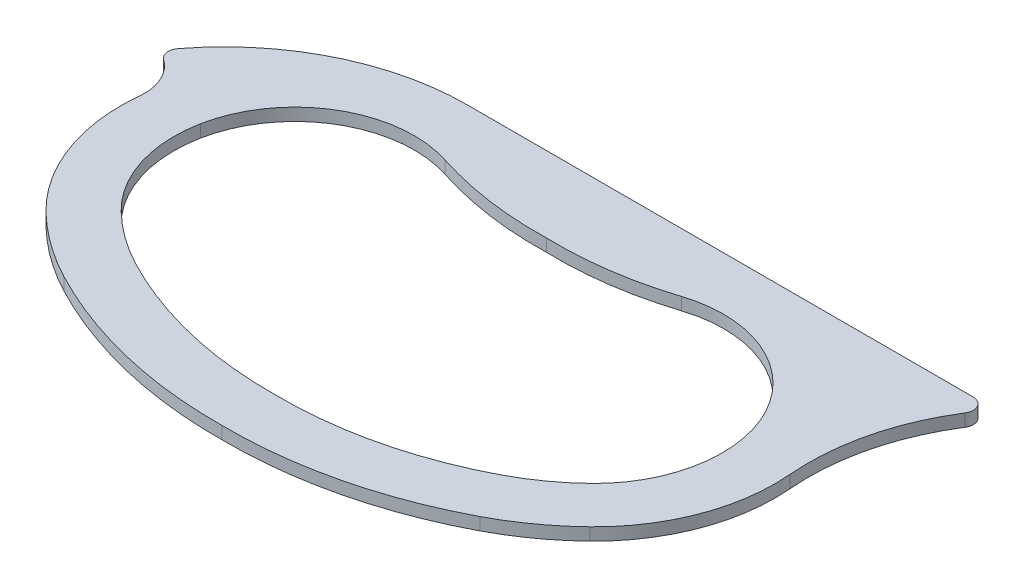
ISO-10303-21;
HEADER;
FILE_DESCRIPTION(('STEP AP214'),'2;1');
FILE_NAME('part.step','',(''),(''),'','','');
FILE_SCHEMA(('AUTOMOTIVE_DESIGN { 1 0 10303 214 1 1 1 1 }'));
ENDSEC;
DATA;
#1=APPLICATION_CONTEXT('core data for automotive mechanical design processes');
#2=APPLICATION_PROTOCOL_DEFINITION('international standard','automotive_design',2000,#1);
#3=PRODUCT_CONTEXT('',#1,'mechanical');
#4=PRODUCT('Part','Part','',(#3));
#5=PRODUCT_RELATED_PRODUCT_CATEGORY('part','',(#4));
#6=PRODUCT_DEFINITION_FORMATION('','',#4);
#7=PRODUCT_DEFINITION_CONTEXT('part definition',#1,'design');
#8=PRODUCT_DEFINITION('design','',#6,#7);
#9=PRODUCT_DEFINITION_SHAPE('','',#8);
#10=(LENGTH_UNIT() NAMED_UNIT(*) SI_UNIT(.MILLI.,.METRE.));
#11=(NAMED_UNIT(*) PLANE_ANGLE_UNIT() SI_UNIT($,.RADIAN.));
#12=(NAMED_UNIT(*) SI_UNIT($,.STERADIAN.) SOLID_ANGLE_UNIT());
#13=UNCERTAINTY_MEASURE_WITH_UNIT(LENGTH_MEASURE(1.E-05),#10,'distance_accuracy_value','');
#14=(GEOMETRIC_REPRESENTATION_CONTEXT(3) GLOBAL_UNCERTAINTY_ASSIGNED_CONTEXT((#13)) GLOBAL_UNIT_ASSIGNED_CONTEXT((#10,
#11,#12)) REPRESENTATION_CONTEXT('',''));
#15=CARTESIAN_POINT('',(0.,0.,0.));
#16=DIRECTION('',(0.,0.,1.));
#17=DIRECTION('',(1.,0.,0.));
#18=AXIS2_PLACEMENT_3D('',#15,#16,#17);
#19=CARTESIAN_POINT('',(-31.7447289656254,3.,41.3908696564592));
#20=DIRECTION('',(0.,1.,0.));
#21=DIRECTION('',(0.,0.,1.));
#22=AXIS2_PLACEMENT_3D('',#19,#20,#21);
#23=PLANE('',#22);
#24=CARTESIAN_POINT('',(-31.7447289656254,3.,41.3908696564592));
#25=DIRECTION('',(0.,1.,0.));
#26=DIRECTION('',(0.,0.,1.));
#27=AXIS2_PLACEMENT_3D('',#24,#25,#26);
#28=CIRCLE('',#27,58.5377173375249);
#29=CARTESIAN_POINT('',(-31.7447289656254,3.,-17.1468476691929));
#30=VERTEX_POINT('',#29);
#31=CARTESIAN_POINT('',(-78.384627261813,3.,6.01595991241534));
#32=VERTEX_POINT('',#31);
#33=EDGE_CURVE('E266',#30,#32,#28,.T.);
#34=ORIENTED_EDGE('',*,*,#33,.T.);
#35=CARTESIAN_POINT('',(-76.1537286012135,3.,7.70802704055631));
#36=DIRECTION('',(0.,1.,0.));
#37=DIRECTION('',(0.,0.,1.));
#38=AXIS2_PLACEMENT_3D('',#35,#36,#37);
#39=CIRCLE('',#38,2.8);
#40=CARTESIAN_POINT('',(-77.7967382942179,3.,9.97529834075258));
#41=VERTEX_POINT('',#40);
#42=EDGE_CURVE('E269',#32,#41,#39,.T.);
#43=ORIENTED_EDGE('',*,*,#42,.T.);
#44=CARTESIAN_POINT('',(-84.5355399107844,3.,19.2745079364176));
#45=DIRECTION('',(0.,-1.,0.));
#46=DIRECTION('',(0.,0.,-1.));
#47=AXIS2_PLACEMENT_3D('',#44,#45,#46);
#48=CIRCLE('',#47,11.4841955021476);
#49=CARTESIAN_POINT('',(-73.1089146980619,3.,20.4229776049423));
#50=VERTEX_POINT('',#49);
#51=EDGE_CURVE('E272',#41,#50,#48,.T.);
#52=ORIENTED_EDGE('',*,*,#51,.T.);
#53=CARTESIAN_POINT('',(-29.8103535259317,3.,24.7748385674937));
#54=DIRECTION('',(0.,1.,0.));
#55=DIRECTION('',(0.,0.,-1.));
#56=AXIS2_PLACEMENT_3D('',#53,#54,#55);
#57=CIRCLE('',#56,43.5167105077358);
#58=CARTESIAN_POINT('',(-60.0306601298384,3.,56.0867717907866));
#59=VERTEX_POINT('',#58);
#60=EDGE_CURVE('E274',#50,#59,#57,.T.);
#61=ORIENTED_EDGE('',*,*,#60,.T.);
#62=CARTESIAN_POINT('',(-13.3661326347816,3.,7.73661479294711));
#63=DIRECTION('',(0.,1.,0.));
#64=DIRECTION('',(0.,0.,1.));
#65=AXIS2_PLACEMENT_3D('',#62,#63,#64);
#66=CIRCLE('',#65,67.1960996491064);
#67=CARTESIAN_POINT('',(-44.5902153699683,3.,67.2376439050465));
#68=VERTEX_POINT('',#67);
#69=EDGE_CURVE('E276',#59,#68,#66,.T.);
#70=ORIENTED_EDGE('',*,*,#69,.T.);
#71=CARTESIAN_POINT('',(4.30741818289308,3.,-25.9423397062211));
#72=DIRECTION('',(0.,1.,0.));
#73=DIRECTION('',(0.,0.,1.));
#74=AXIS2_PLACEMENT_3D('',#71,#72,#73);
#75=CIRCLE('',#74,105.230641511235);
#76=CARTESIAN_POINT('',(5.51444306841968,3.,79.2813791208183));
#77=VERTEX_POINT('',#76);
#78=EDGE_CURVE('E278',#68,#77,#75,.T.);
#79=ORIENTED_EDGE('',*,*,#78,.T.);
#80=CARTESIAN_POINT('',(6.7214679538708,3.,-25.9423397062211));
#81=DIRECTION('',(0.,1.,0.));
#82=DIRECTION('',(0.,0.,-1.));
#83=AXIS2_PLACEMENT_3D('',#80,#81,#82);
#84=CIRCLE('',#83,105.230641511234);
#85=CARTESIAN_POINT('',(55.619101506732,3.,67.2376439050462));
#86=VERTEX_POINT('',#85);
#87=EDGE_CURVE('E280',#77,#86,#84,.T.);
#88=ORIENTED_EDGE('',*,*,#87,.T.);
#89=CARTESIAN_POINT('',(24.3950187715454,3.,7.73661479294711));
#90=DIRECTION('',(0.,1.,0.));
#91=DIRECTION('',(0.,0.,-1.));
#92=AXIS2_PLACEMENT_3D('',#89,#90,#91);
#93=CIRCLE('',#92,67.1960996491064);
#94=CARTESIAN_POINT('',(71.0595462666022,3.,56.0867717907866));
#95=VERTEX_POINT('',#94);
#96=EDGE_CURVE('E282',#86,#95,#93,.T.);
#97=ORIENTED_EDGE('',*,*,#96,.T.);
#98=CARTESIAN_POINT('',(40.8392396626955,3.,24.7748385674937));
#99=DIRECTION('',(0.,1.,0.));
#100=DIRECTION('',(0.,0.,-1.));
#101=AXIS2_PLACEMENT_3D('',#98,#99,#100);
#102=CIRCLE('',#101,43.5167105077358);
#103=CARTESIAN_POINT('',(84.1970453406871,3.,21.0593601052228));
#104=VERTEX_POINT('',#103);
#105=EDGE_CURVE('E284',#95,#104,#102,.T.);
#106=ORIENTED_EDGE('',*,*,#105,.T.);
#107=CARTESIAN_POINT('',(138.651349121471,3.,16.3929848191192));
#108=DIRECTION('',(0.,-1.,0.));
#109=DIRECTION('',(0.,0.,1.));
#110=AXIS2_PLACEMENT_3D('',#107,#108,#109);
#111=CIRCLE('',#110,54.6538768849991);
#112=CARTESIAN_POINT('',(92.4781186143652,3.,-12.8487497925334));
#113=VERTEX_POINT('',#112);
#114=EDGE_CURVE('E286',#104,#113,#111,.T.);
#115=ORIENTED_EDGE('',*,*,#114,.T.);
#116=CARTESIAN_POINT('',(90.1125948347451,3.,-14.3468476691929));
#117=DIRECTION('',(0.,1.,0.));
#118=DIRECTION('',(0.,0.,1.));
#119=AXIS2_PLACEMENT_3D('',#116,#117,#118);
#120=CIRCLE('',#119,2.8);
#121=CARTESIAN_POINT('',(90.1125948347451,3.,-17.1468476691929));
#122=VERTEX_POINT('',#121);
#123=EDGE_CURVE('E288',#113,#122,#120,.T.);
#124=ORIENTED_EDGE('',*,*,#123,.T.);
#125=DIRECTION('',(-1.,0.,0.));
#126=VECTOR('',#125,1.);
#127=CARTESIAN_POINT('',(-31.7447289656254,3.,-17.1468476691929));
#128=LINE('',#127,#126);
#129=EDGE_CURVE('E290',#122,#30,#128,.T.);
#130=ORIENTED_EDGE('',*,*,#129,.T.);
#131=EDGE_LOOP('',(#34,#43,#52,#61,#70,#79,#88,#97,#106,#115,#124,#130));
#132=FACE_BOUND('',#131,.T.);
#133=CARTESIAN_POINT('',(-31.7447289656254,3.,24.3993878805688));
#134=DIRECTION('',(0.,1.,0.));
#135=DIRECTION('',(0.,0.,1.));
#136=AXIS2_PLACEMENT_3D('',#133,#134,#135);
#137=CIRCLE('',#136,28.7462355497617);
#138=CARTESIAN_POINT('',(-22.9726922600979,3.,-2.97573641721773));
#139=VERTEX_POINT('',#138);
#140=CARTESIAN_POINT('',(-59.9643273959869,3.,18.9221328461994));
#141=VERTEX_POINT('',#140);
#142=EDGE_CURVE('E195',#139,#141,#137,.T.);
#143=ORIENTED_EDGE('',*,*,#142,.F.);
#144=CARTESIAN_POINT('',(3.18944048075675,3.,-84.6205880883009));
#145=DIRECTION('',(0.,-1.,0.));
#146=DIRECTION('',(0.,0.,-1.));
#147=AXIS2_PLACEMENT_3D('',#144,#145,#146);
#148=CIRCLE('',#147,85.7341180274415);
#149=CARTESIAN_POINT('',(5.5144430683819,3.,1.08199855242315));
#150=VERTEX_POINT('',#149);
#151=EDGE_CURVE('E187',#150,#139,#148,.T.);
#152=ORIENTED_EDGE('',*,*,#151,.F.);
#153=CARTESIAN_POINT('',(7.83944565600712,3.,-84.6205880883009));
#154=DIRECTION('',(0.,-1.,0.));
#155=DIRECTION('',(0.,0.,1.));
#156=AXIS2_PLACEMENT_3D('',#153,#154,#155);
#157=CIRCLE('',#156,85.7341180274415);
#158=CARTESIAN_POINT('',(34.0015783968618,3.,-2.97573641721771));
#159=VERTEX_POINT('',#158);
#160=EDGE_CURVE('E224',#159,#150,#157,.T.);
#161=ORIENTED_EDGE('',*,*,#160,.F.);
#162=CARTESIAN_POINT('',(42.7736151023893,3.,24.3993878805688));
#163=DIRECTION('',(0.,1.,0.));
#164=DIRECTION('',(0.,0.,-1.));
#165=AXIS2_PLACEMENT_3D('',#162,#163,#164);
#166=CIRCLE('',#165,28.7462355497617);
#167=CARTESIAN_POINT('',(70.9932135327507,3.,18.9221328461994));
#168=VERTEX_POINT('',#167);
#169=EDGE_CURVE('E222',#168,#159,#166,.T.);
#170=ORIENTED_EDGE('',*,*,#169,.F.);
#171=CARTESIAN_POINT('',(40.8392396626955,3.,24.7748385674937));
#172=DIRECTION('',(0.,1.,0.));
#173=DIRECTION('',(0.,0.,-1.));
#174=AXIS2_PLACEMENT_3D('',#171,#172,#173);
#175=CIRCLE('',#174,30.7167105077358);
#176=CARTESIAN_POINT('',(62.1705489132466,3.,46.876683514769));
#177=VERTEX_POINT('',#176);
#178=EDGE_CURVE('E220',#177,#168,#175,.T.);
#179=ORIENTED_EDGE('',*,*,#178,.F.);
#180=CARTESIAN_POINT('',(24.3950187715454,3.,7.73661479294709));
#181=DIRECTION('',(0.,1.,0.));
#182=DIRECTION('',(0.,0.,-1.));
#183=AXIS2_PLACEMENT_3D('',#180,#181,#182);
#184=CIRCLE('',#183,54.3960996491064);
#185=CARTESIAN_POINT('',(49.6713119609484,3.,55.9034567035276));
#186=VERTEX_POINT('',#185);
#187=EDGE_CURVE('E218',#186,#177,#184,.T.);
#188=ORIENTED_EDGE('',*,*,#187,.F.);
#189=CARTESIAN_POINT('',(6.72146795387057,3.,-25.942339706222));
#190=DIRECTION('',(0.,1.,0.));
#191=DIRECTION('',(0.,0.,-1.));
#192=AXIS2_PLACEMENT_3D('',#189,#190,#191);
#193=CIRCLE('',#192,92.4306415112353);
#194=CARTESIAN_POINT('',(5.51444306841505,3.,66.4804203753964));
#195=VERTEX_POINT('',#194);
#196=EDGE_CURVE('E216',#195,#186,#193,.T.);
#197=ORIENTED_EDGE('',*,*,#196,.F.);
#198=CARTESIAN_POINT('',(4.30741818289331,3.,-25.942339706222));
#199=DIRECTION('',(0.,1.,0.));
#200=DIRECTION('',(0.,0.,1.));
#201=AXIS2_PLACEMENT_3D('',#198,#199,#200);
#202=CIRCLE('',#201,92.4306415112352);
#203=CARTESIAN_POINT('',(-38.6424258241845,3.,55.9034567035275));
#204=VERTEX_POINT('',#203);
#205=EDGE_CURVE('E214',#204,#195,#202,.T.);
#206=ORIENTED_EDGE('',*,*,#205,.F.);
#207=CARTESIAN_POINT('',(-13.3661326347816,3.,7.73661479294709));
#208=DIRECTION('',(0.,1.,0.));
#209=DIRECTION('',(0.,0.,1.));
#210=AXIS2_PLACEMENT_3D('',#207,#208,#209);
#211=CIRCLE('',#210,54.3960996491059);
#212=CARTESIAN_POINT('',(-51.1416627764824,3.,46.8766835147686));
#213=VERTEX_POINT('',#212);
#214=EDGE_CURVE('E210',#213,#204,#211,.T.);
#215=ORIENTED_EDGE('',*,*,#214,.F.);
#216=CARTESIAN_POINT('',(-29.8103535259317,3.,24.7748385674937));
#217=DIRECTION('',(0.,1.,0.));
#218=DIRECTION('',(0.,0.,1.));
#219=AXIS2_PLACEMENT_3D('',#216,#217,#218);
#220=CIRCLE('',#219,30.7167105077358);
#221=EDGE_CURVE('E208',#141,#213,#220,.T.);
#222=ORIENTED_EDGE('',*,*,#221,.F.);
#223=EDGE_LOOP('',(#143,#152,#161,#170,#179,#188,#197,#206,#215,#222));
#224=FACE_BOUND('',#223,.T.);
#225=ADVANCED_FACE('F38',(#132,#224),#23,.T.);
#226=CARTESIAN_POINT('',(-31.7447289656254,0.,41.3908696564592));
#227=DIRECTION('',(0.,1.,0.));
#228=DIRECTION('',(0.,0.,1.));
#229=AXIS2_PLACEMENT_3D('',#226,#227,#228);
#230=PLANE('',#229);
#231=CARTESIAN_POINT('',(-31.7447289656254,0.,41.3908696564592));
#232=DIRECTION('',(0.,1.,0.));
#233=DIRECTION('',(0.,0.,1.));
#234=AXIS2_PLACEMENT_3D('',#231,#232,#233);
#235=CIRCLE('',#234,58.5377173375249);
#236=CARTESIAN_POINT('',(-31.7447289656254,0.,-17.1468476691929));
#237=VERTEX_POINT('',#236);
#238=CARTESIAN_POINT('',(-78.384627261813,0.,6.01595991241534));
#239=VERTEX_POINT('',#238);
#240=EDGE_CURVE('E203',#237,#239,#235,.T.);
#241=ORIENTED_EDGE('',*,*,#240,.F.);
#242=DIRECTION('',(-1.,0.,0.));
#243=VECTOR('',#242,1.);
#244=CARTESIAN_POINT('',(-31.7447289656254,0.,-17.1468476691929));
#245=LINE('',#244,#243);
#246=CARTESIAN_POINT('',(90.1125948347451,0.,-17.1468476691929));
#247=VERTEX_POINT('',#246);
#248=EDGE_CURVE('E270',#247,#237,#245,.T.);
#249=ORIENTED_EDGE('',*,*,#248,.F.);
#250=CARTESIAN_POINT('',(90.1125948347451,0.,-14.3468476691929));
#251=DIRECTION('',(0.,1.,0.));
#252=DIRECTION('',(0.,0.,1.));
#253=AXIS2_PLACEMENT_3D('',#250,#251,#252);
#254=CIRCLE('',#253,2.8);
#255=CARTESIAN_POINT('',(92.4781186143652,0.,-12.8487497925334));
#256=VERTEX_POINT('',#255);
#257=EDGE_CURVE('E313',#256,#247,#254,.T.);
#258=ORIENTED_EDGE('',*,*,#257,.F.);
#259=CARTESIAN_POINT('',(138.651349121471,0.,16.3929848191192));
#260=DIRECTION('',(0.,-1.,0.));
#261=DIRECTION('',(0.,0.,1.));
#262=AXIS2_PLACEMENT_3D('',#259,#260,#261);
#263=CIRCLE('',#262,54.6538768849991);
#264=CARTESIAN_POINT('',(84.1970453406871,0.,21.0593601052228));
#265=VERTEX_POINT('',#264);
#266=EDGE_CURVE('E311',#265,#256,#263,.T.);
#267=ORIENTED_EDGE('',*,*,#266,.F.);
#268=CARTESIAN_POINT('',(40.8392396626955,0.,24.7748385674937));
#269=DIRECTION('',(0.,1.,0.));
#270=DIRECTION('',(0.,0.,-1.));
#271=AXIS2_PLACEMENT_3D('',#268,#269,#270);
#272=CIRCLE('',#271,43.5167105077358);
#273=CARTESIAN_POINT('',(71.0595462666022,0.,56.0867717907866));
#274=VERTEX_POINT('',#273);
#275=EDGE_CURVE('E309',#274,#265,#272,.T.);
#276=ORIENTED_EDGE('',*,*,#275,.F.);
#277=CARTESIAN_POINT('',(24.3950187715454,0.,7.73661479294711));
#278=DIRECTION('',(0.,1.,0.));
#279=DIRECTION('',(0.,0.,-1.));
#280=AXIS2_PLACEMENT_3D('',#277,#278,#279);
#281=CIRCLE('',#280,67.1960996491064);
#282=CARTESIAN_POINT('',(55.619101506732,0.,67.2376439050462));
#283=VERTEX_POINT('',#282);
#284=EDGE_CURVE('E307',#283,#274,#281,.T.);
#285=ORIENTED_EDGE('',*,*,#284,.F.);
#286=CARTESIAN_POINT('',(6.7214679538708,0.,-25.9423397062211));
#287=DIRECTION('',(0.,1.,0.));
#288=DIRECTION('',(0.,0.,-1.));
#289=AXIS2_PLACEMENT_3D('',#286,#287,#288);
#290=CIRCLE('',#289,105.230641511234);
#291=CARTESIAN_POINT('',(5.51444306841968,0.,79.2813791208183));
#292=VERTEX_POINT('',#291);
#293=EDGE_CURVE('E305',#292,#283,#290,.T.);
#294=ORIENTED_EDGE('',*,*,#293,.F.);
#295=CARTESIAN_POINT('',(4.30741818289308,0.,-25.9423397062211));
#296=DIRECTION('',(0.,1.,0.));
#297=DIRECTION('',(0.,0.,1.));
#298=AXIS2_PLACEMENT_3D('',#295,#296,#297);
#299=CIRCLE('',#298,105.230641511235);
#300=CARTESIAN_POINT('',(-44.5902153699683,0.,67.2376439050465));
#301=VERTEX_POINT('',#300);
#302=EDGE_CURVE('E303',#301,#292,#299,.T.);
#303=ORIENTED_EDGE('',*,*,#302,.F.);
#304=CARTESIAN_POINT('',(-13.3661326347816,0.,7.73661479294711));
#305=DIRECTION('',(0.,1.,0.));
#306=DIRECTION('',(0.,0.,1.));
#307=AXIS2_PLACEMENT_3D('',#304,#305,#306);
#308=CIRCLE('',#307,67.1960996491064);
#309=CARTESIAN_POINT('',(-60.0306601298384,0.,56.0867717907866));
#310=VERTEX_POINT('',#309);
#311=EDGE_CURVE('E301',#310,#301,#308,.T.);
#312=ORIENTED_EDGE('',*,*,#311,.F.);
#313=CARTESIAN_POINT('',(-29.8103535259317,0.,24.7748385674937));
#314=DIRECTION('',(0.,1.,0.));
#315=DIRECTION('',(0.,0.,-1.));
#316=AXIS2_PLACEMENT_3D('',#313,#314,#315);
#317=CIRCLE('',#316,43.5167105077358);
#318=CARTESIAN_POINT('',(-73.1089146980619,0.,20.4229776049423));
#319=VERTEX_POINT('',#318);
#320=EDGE_CURVE('E299',#319,#310,#317,.T.);
#321=ORIENTED_EDGE('',*,*,#320,.F.);
#322=CARTESIAN_POINT('',(-84.5355399107844,0.,19.2745079364176));
#323=DIRECTION('',(0.,-1.,0.));
#324=DIRECTION('',(0.,0.,-1.));
#325=AXIS2_PLACEMENT_3D('',#322,#323,#324);
#326=CIRCLE('',#325,11.4841955021476);
#327=CARTESIAN_POINT('',(-77.7967382942179,0.,9.97529834075258));
#328=VERTEX_POINT('',#327);
#329=EDGE_CURVE('E297',#328,#319,#326,.T.);
#330=ORIENTED_EDGE('',*,*,#329,.F.);
#331=CARTESIAN_POINT('',(-76.1537286012135,0.,7.70802704055631));
#332=DIRECTION('',(0.,1.,0.));
#333=DIRECTION('',(0.,0.,1.));
#334=AXIS2_PLACEMENT_3D('',#331,#332,#333);
#335=CIRCLE('',#334,2.8);
#336=EDGE_CURVE('E295',#239,#328,#335,.T.);
#337=ORIENTED_EDGE('',*,*,#336,.F.);
#338=EDGE_LOOP('',(#241,#249,#258,#267,#276,#285,#294,#303,#312,#321,#330,#337));
#339=FACE_BOUND('',#338,.T.);
#340=CARTESIAN_POINT('',(3.18944048075675,0.,-84.6205880883009));
#341=DIRECTION('',(0.,-1.,0.));
#342=DIRECTION('',(0.,0.,-1.));
#343=AXIS2_PLACEMENT_3D('',#340,#341,#342);
#344=CIRCLE('',#343,85.7341180274415);
#345=CARTESIAN_POINT('',(5.5144430683819,0.,1.08199855242315));
#346=VERTEX_POINT('',#345);
#347=CARTESIAN_POINT('',(-22.9726922600979,0.,-2.97573641721773));
#348=VERTEX_POINT('',#347);
#349=EDGE_CURVE('E61',#346,#348,#344,.T.);
#350=ORIENTED_EDGE('',*,*,#349,.T.);
#351=CARTESIAN_POINT('',(-31.7447289656254,0.,24.3993878805688));
#352=DIRECTION('',(0.,1.,0.));
#353=DIRECTION('',(0.,0.,1.));
#354=AXIS2_PLACEMENT_3D('',#351,#352,#353);
#355=CIRCLE('',#354,28.7462355497617);
#356=CARTESIAN_POINT('',(-59.9643273959869,0.,18.9221328461994));
#357=VERTEX_POINT('',#356);
#358=EDGE_CURVE('E202',#348,#357,#355,.T.);
#359=ORIENTED_EDGE('',*,*,#358,.T.);
#360=CARTESIAN_POINT('',(-29.8103535259317,0.,24.7748385674937));
#361=DIRECTION('',(0.,1.,0.));
#362=DIRECTION('',(0.,0.,1.));
#363=AXIS2_PLACEMENT_3D('',#360,#361,#362);
#364=CIRCLE('',#363,30.7167105077358);
#365=CARTESIAN_POINT('',(-51.1416627764824,0.,46.8766835147686));
#366=VERTEX_POINT('',#365);
#367=EDGE_CURVE('E228',#357,#366,#364,.T.);
#368=ORIENTED_EDGE('',*,*,#367,.T.);
#369=CARTESIAN_POINT('',(-13.3661326347816,0.,7.73661479294709));
#370=DIRECTION('',(0.,1.,0.));
#371=DIRECTION('',(0.,0.,1.));
#372=AXIS2_PLACEMENT_3D('',#369,#370,#371);
#373=CIRCLE('',#372,54.3960996491059);
#374=CARTESIAN_POINT('',(-38.6424258241845,0.,55.9034567035275));
#375=VERTEX_POINT('',#374);
#376=EDGE_CURVE('E231',#366,#375,#373,.T.);
#377=ORIENTED_EDGE('',*,*,#376,.T.);
#378=CARTESIAN_POINT('',(4.30741818289331,0.,-25.942339706222));
#379=DIRECTION('',(0.,1.,0.));
#380=DIRECTION('',(0.,0.,1.));
#381=AXIS2_PLACEMENT_3D('',#378,#379,#380);
#382=CIRCLE('',#381,92.4306415112352);
#383=CARTESIAN_POINT('',(5.51444306841505,0.,66.4804203753964));
#384=VERTEX_POINT('',#383);
#385=EDGE_CURVE('E234',#375,#384,#382,.T.);
#386=ORIENTED_EDGE('',*,*,#385,.T.);
#387=CARTESIAN_POINT('',(6.72146795387057,0.,-25.942339706222));
#388=DIRECTION('',(0.,1.,0.));
#389=DIRECTION('',(0.,0.,-1.));
#390=AXIS2_PLACEMENT_3D('',#387,#388,#389);
#391=CIRCLE('',#390,92.4306415112353);
#392=CARTESIAN_POINT('',(49.6713119609484,0.,55.9034567035276));
#393=VERTEX_POINT('',#392);
#394=EDGE_CURVE('E237',#384,#393,#391,.T.);
#395=ORIENTED_EDGE('',*,*,#394,.T.);
#396=CARTESIAN_POINT('',(24.3950187715454,0.,7.73661479294709));
#397=DIRECTION('',(0.,1.,0.));
#398=DIRECTION('',(0.,0.,-1.));
#399=AXIS2_PLACEMENT_3D('',#396,#397,#398);
#400=CIRCLE('',#399,54.3960996491064);
#401=CARTESIAN_POINT('',(62.1705489132466,0.,46.876683514769));
#402=VERTEX_POINT('',#401);
#403=EDGE_CURVE('E240',#393,#402,#400,.T.);
#404=ORIENTED_EDGE('',*,*,#403,.T.);
#405=CARTESIAN_POINT('',(40.8392396626955,0.,24.7748385674937));
#406=DIRECTION('',(0.,1.,0.));
#407=DIRECTION('',(0.,0.,-1.));
#408=AXIS2_PLACEMENT_3D('',#405,#406,#407);
#409=CIRCLE('',#408,30.7167105077358);
#410=CARTESIAN_POINT('',(70.9932135327507,0.,18.9221328461994));
#411=VERTEX_POINT('',#410);
#412=EDGE_CURVE('E243',#402,#411,#409,.T.);
#413=ORIENTED_EDGE('',*,*,#412,.T.);
#414=CARTESIAN_POINT('',(42.7736151023893,0.,24.3993878805688));
#415=DIRECTION('',(0.,1.,0.));
#416=DIRECTION('',(0.,0.,-1.));
#417=AXIS2_PLACEMENT_3D('',#414,#415,#416);
#418=CIRCLE('',#417,28.7462355497617);
#419=CARTESIAN_POINT('',(34.0015783968618,0.,-2.97573641721771));
#420=VERTEX_POINT('',#419);
#421=EDGE_CURVE('E246',#411,#420,#418,.T.);
#422=ORIENTED_EDGE('',*,*,#421,.T.);
#423=CARTESIAN_POINT('',(7.83944565600712,0.,-84.6205880883009));
#424=DIRECTION('',(0.,-1.,0.));
#425=DIRECTION('',(0.,0.,1.));
#426=AXIS2_PLACEMENT_3D('',#423,#424,#425);
#427=CIRCLE('',#426,85.7341180274415);
#428=EDGE_CURVE('E196',#420,#346,#427,.T.);
#429=ORIENTED_EDGE('',*,*,#428,.T.);
#430=EDGE_LOOP('',(#350,#359,#368,#377,#386,#395,#404,#413,#422,#429));
#431=FACE_BOUND('',#430,.T.);
#432=ADVANCED_FACE('F355',(#339,#431),#230,.F.);
#433=CARTESIAN_POINT('',(-31.7447289656254,3.,41.3908696564592));
#434=DIRECTION('',(0.,-1.,0.));
#435=DIRECTION('',(0.,0.,-1.));
#436=AXIS2_PLACEMENT_3D('',#433,#434,#435);
#437=CYLINDRICAL_SURFACE('',#436,58.5377173375249);
#438=ORIENTED_EDGE('',*,*,#240,.T.);
#439=DIRECTION('',(0.,-1.,0.));
#440=VECTOR('',#439,1.);
#441=CARTESIAN_POINT('',(-78.384627261813,3.,6.01595991241534));
#442=LINE('',#441,#440);
#443=EDGE_CURVE('E11',#32,#239,#442,.T.);
#444=ORIENTED_EDGE('',*,*,#443,.F.);
#445=ORIENTED_EDGE('',*,*,#33,.F.);
#446=DIRECTION('',(0.,-1.,0.));
#447=VECTOR('',#446,1.);
#448=CARTESIAN_POINT('',(-31.7447289656254,3.,-17.1468476691929));
#449=LINE('',#448,#447);
#450=EDGE_CURVE('E292',#30,#237,#449,.T.);
#451=ORIENTED_EDGE('',*,*,#450,.T.);
#452=EDGE_LOOP('',(#438,#444,#445,#451));
#453=FACE_BOUND('',#452,.T.);
#454=ADVANCED_FACE('F40',(#453),#437,.T.);
#455=CARTESIAN_POINT('',(-76.1537286012135,3.,7.70802704055631));
#456=DIRECTION('',(0.,-1.,0.));
#457=DIRECTION('',(0.,0.,-1.));
#458=AXIS2_PLACEMENT_3D('',#455,#456,#457);
#459=CYLINDRICAL_SURFACE('',#458,2.8);
#460=ORIENTED_EDGE('',*,*,#336,.T.);
#461=DIRECTION('',(0.,-1.,0.));
#462=VECTOR('',#461,1.);
#463=CARTESIAN_POINT('',(-77.7967382942179,3.,9.97529834075258));
#464=LINE('',#463,#462);
#465=EDGE_CURVE('E46',#41,#328,#464,.T.);
#466=ORIENTED_EDGE('',*,*,#465,.F.);
#467=ORIENTED_EDGE('',*,*,#42,.F.);
#468=ORIENTED_EDGE('',*,*,#443,.T.);
#469=EDGE_LOOP('',(#460,#466,#467,#468));
#470=FACE_BOUND('',#469,.T.);
#471=ADVANCED_FACE('F372',(#470),#459,.T.);
#472=CARTESIAN_POINT('',(-84.5355399107844,3.,19.2745079364176));
#473=DIRECTION('',(0.,-1.,0.));
#474=DIRECTION('',(0.,0.,-1.));
#475=AXIS2_PLACEMENT_3D('',#472,#473,#474);
#476=CYLINDRICAL_SURFACE('',#475,11.4841955021476);
#477=ORIENTED_EDGE('',*,*,#329,.T.);
#478=DIRECTION('',(0.,-1.,0.));
#479=VECTOR('',#478,1.);
#480=CARTESIAN_POINT('',(-73.1089146980619,3.,20.4229776049423));
#481=LINE('',#480,#479);
#482=EDGE_CURVE('E342',#50,#319,#481,.T.);
#483=ORIENTED_EDGE('',*,*,#482,.F.);
#484=ORIENTED_EDGE('',*,*,#51,.F.);
#485=ORIENTED_EDGE('',*,*,#465,.T.);
#486=EDGE_LOOP('',(#477,#483,#484,#485));
#487=FACE_BOUND('',#486,.T.);
#488=ADVANCED_FACE('F349',(#487),#476,.F.);
#489=CARTESIAN_POINT('',(-29.8103535259317,3.,24.7748385674937));
#490=DIRECTION('',(0.,-1.,0.));
#491=DIRECTION('',(0.,0.,-1.));
#492=AXIS2_PLACEMENT_3D('',#489,#490,#491);
#493=CYLINDRICAL_SURFACE('',#492,43.5167105077358);
#494=ORIENTED_EDGE('',*,*,#320,.T.);
#495=DIRECTION('',(0.,-1.,0.));
#496=VECTOR('',#495,1.);
#497=CARTESIAN_POINT('',(-60.0306601298384,3.,56.0867717907866));
#498=LINE('',#497,#496);
#499=EDGE_CURVE('E339',#59,#310,#498,.T.);
#500=ORIENTED_EDGE('',*,*,#499,.F.);
#501=ORIENTED_EDGE('',*,*,#60,.F.);
#502=ORIENTED_EDGE('',*,*,#482,.T.);
#503=EDGE_LOOP('',(#494,#500,#501,#502));
#504=FACE_BOUND('',#503,.T.);
#505=ADVANCED_FACE('F361',(#504),#493,.T.);
#506=CARTESIAN_POINT('',(-13.3661326347816,3.,7.73661479294711));
#507=DIRECTION('',(0.,-1.,0.));
#508=DIRECTION('',(0.,0.,-1.));
#509=AXIS2_PLACEMENT_3D('',#506,#507,#508);
#510=CYLINDRICAL_SURFACE('',#509,67.1960996491064);
#511=ORIENTED_EDGE('',*,*,#311,.T.);
#512=DIRECTION('',(0.,-1.,0.));
#513=VECTOR('',#512,1.);
#514=CARTESIAN_POINT('',(-44.5902153699683,3.,67.2376439050465));
#515=LINE('',#514,#513);
#516=EDGE_CURVE('E336',#68,#301,#515,.T.);
#517=ORIENTED_EDGE('',*,*,#516,.F.);
#518=ORIENTED_EDGE('',*,*,#69,.F.);
#519=ORIENTED_EDGE('',*,*,#499,.T.);
#520=EDGE_LOOP('',(#511,#517,#518,#519));
#521=FACE_BOUND('',#520,.T.);
#522=ADVANCED_FACE('F365',(#521),#510,.T.);
#523=CARTESIAN_POINT('',(4.30741818289308,3.,-25.9423397062211));
#524=DIRECTION('',(0.,-1.,0.));
#525=DIRECTION('',(0.,0.,-1.));
#526=AXIS2_PLACEMENT_3D('',#523,#524,#525);
#527=CYLINDRICAL_SURFACE('',#526,105.230641511235);
#528=ORIENTED_EDGE('',*,*,#302,.T.);
#529=DIRECTION('',(0.,-1.,0.));
#530=VECTOR('',#529,1.);
#531=CARTESIAN_POINT('',(5.51444306841968,3.,79.2813791208183));
#532=LINE('',#531,#530);
#533=EDGE_CURVE('E333',#77,#292,#532,.T.);
#534=ORIENTED_EDGE('',*,*,#533,.F.);
#535=ORIENTED_EDGE('',*,*,#78,.F.);
#536=ORIENTED_EDGE('',*,*,#516,.T.);
#537=EDGE_LOOP('',(#528,#534,#535,#536));
#538=FACE_BOUND('',#537,.T.);
#539=ADVANCED_FACE('F405',(#538),#527,.T.);
#540=CARTESIAN_POINT('',(6.7214679538708,3.,-25.9423397062211));
#541=DIRECTION('',(0.,-1.,0.));
#542=DIRECTION('',(0.,0.,-1.));
#543=AXIS2_PLACEMENT_3D('',#540,#541,#542);
#544=CYLINDRICAL_SURFACE('',#543,105.230641511234);
#545=ORIENTED_EDGE('',*,*,#293,.T.);
#546=DIRECTION('',(0.,-1.,0.));
#547=VECTOR('',#546,1.);
#548=CARTESIAN_POINT('',(55.619101506732,3.,67.2376439050462));
#549=LINE('',#548,#547);
#550=EDGE_CURVE('E330',#86,#283,#549,.T.);
#551=ORIENTED_EDGE('',*,*,#550,.F.);
#552=ORIENTED_EDGE('',*,*,#87,.F.);
#553=ORIENTED_EDGE('',*,*,#533,.T.);
#554=EDGE_LOOP('',(#545,#551,#552,#553));
#555=FACE_BOUND('',#554,.T.);
#556=ADVANCED_FACE('F403',(#555),#544,.T.);
#557=CARTESIAN_POINT('',(24.3950187715454,3.,7.73661479294711));
#558=DIRECTION('',(0.,-1.,0.));
#559=DIRECTION('',(0.,0.,-1.));
#560=AXIS2_PLACEMENT_3D('',#557,#558,#559);
#561=CYLINDRICAL_SURFACE('',#560,67.1960996491064);
#562=ORIENTED_EDGE('',*,*,#284,.T.);
#563=DIRECTION('',(0.,-1.,0.));
#564=VECTOR('',#563,1.);
#565=CARTESIAN_POINT('',(71.0595462666022,3.,56.0867717907866));
#566=LINE('',#565,#564);
#567=EDGE_CURVE('E327',#95,#274,#566,.T.);
#568=ORIENTED_EDGE('',*,*,#567,.F.);
#569=ORIENTED_EDGE('',*,*,#96,.F.);
#570=ORIENTED_EDGE('',*,*,#550,.T.);
#571=EDGE_LOOP('',(#562,#568,#569,#570));
#572=FACE_BOUND('',#571,.T.);
#573=ADVANCED_FACE('F399',(#572),#561,.T.);
#574=CARTESIAN_POINT('',(40.8392396626955,3.,24.7748385674937));
#575=DIRECTION('',(0.,-1.,0.));
#576=DIRECTION('',(0.,0.,-1.));
#577=AXIS2_PLACEMENT_3D('',#574,#575,#576);
#578=CYLINDRICAL_SURFACE('',#577,43.5167105077358);
#579=ORIENTED_EDGE('',*,*,#275,.T.);
#580=DIRECTION('',(0.,-1.,0.));
#581=VECTOR('',#580,1.);
#582=CARTESIAN_POINT('',(84.1970453406871,3.,21.0593601052228));
#583=LINE('',#582,#581);
#584=EDGE_CURVE('E324',#104,#265,#583,.T.);
#585=ORIENTED_EDGE('',*,*,#584,.F.);
#586=ORIENTED_EDGE('',*,*,#105,.F.);
#587=ORIENTED_EDGE('',*,*,#567,.T.);
#588=EDGE_LOOP('',(#579,#585,#586,#587));
#589=FACE_BOUND('',#588,.T.);
#590=ADVANCED_FACE('F394',(#589),#578,.T.);
#591=CARTESIAN_POINT('',(138.651349121471,3.,16.3929848191192));
#592=DIRECTION('',(0.,-1.,0.));
#593=DIRECTION('',(0.,0.,-1.));
#594=AXIS2_PLACEMENT_3D('',#591,#592,#593);
#595=CYLINDRICAL_SURFACE('',#594,54.6538768849991);
#596=ORIENTED_EDGE('',*,*,#266,.T.);
#597=DIRECTION('',(0.,-1.,0.));
#598=VECTOR('',#597,1.);
#599=CARTESIAN_POINT('',(92.4781186143652,3.,-12.8487497925334));
#600=LINE('',#599,#598);
#601=EDGE_CURVE('E321',#113,#256,#600,.T.);
#602=ORIENTED_EDGE('',*,*,#601,.F.);
#603=ORIENTED_EDGE('',*,*,#114,.F.);
#604=ORIENTED_EDGE('',*,*,#584,.T.);
#605=EDGE_LOOP('',(#596,#602,#603,#604));
#606=FACE_BOUND('',#605,.T.);
#607=ADVANCED_FACE('F388',(#606),#595,.F.);
#608=CARTESIAN_POINT('',(90.1125948347451,3.,-14.3468476691929));
#609=DIRECTION('',(0.,-1.,0.));
#610=DIRECTION('',(0.,0.,-1.));
#611=AXIS2_PLACEMENT_3D('',#608,#609,#610);
#612=CYLINDRICAL_SURFACE('',#611,2.8);
#613=ORIENTED_EDGE('',*,*,#257,.T.);
#614=DIRECTION('',(0.,-1.,0.));
#615=VECTOR('',#614,1.);
#616=CARTESIAN_POINT('',(90.1125948347451,3.,-17.1468476691929));
#617=LINE('',#616,#615);
#618=EDGE_CURVE('E318',#122,#247,#617,.T.);
#619=ORIENTED_EDGE('',*,*,#618,.F.);
#620=ORIENTED_EDGE('',*,*,#123,.F.);
#621=ORIENTED_EDGE('',*,*,#601,.T.);
#622=EDGE_LOOP('',(#613,#619,#620,#621));
#623=FACE_BOUND('',#622,.T.);
#624=ADVANCED_FACE('F384',(#623),#612,.T.);
#625=CARTESIAN_POINT('',(-31.7447289656254,3.,-17.1468476691929));
#626=DIRECTION('',(0.,0.,1.));
#627=DIRECTION('',(1.,0.,0.));
#628=AXIS2_PLACEMENT_3D('',#625,#626,#627);
#629=PLANE('',#628);
#630=ORIENTED_EDGE('',*,*,#248,.T.);
#631=ORIENTED_EDGE('',*,*,#450,.F.);
#632=ORIENTED_EDGE('',*,*,#129,.F.);
#633=ORIENTED_EDGE('',*,*,#618,.T.);
#634=EDGE_LOOP('',(#630,#631,#632,#633));
#635=FACE_BOUND('',#634,.T.);
#636=ADVANCED_FACE('F379',(#635),#629,.F.);
#637=CARTESIAN_POINT('',(3.18944048075675,3.,-84.6205880883009));
#638=DIRECTION('',(0.,-1.,0.));
#639=DIRECTION('',(0.,0.,-1.));
#640=AXIS2_PLACEMENT_3D('',#637,#638,#639);
#641=CYLINDRICAL_SURFACE('',#640,85.7341180274415);
#642=ORIENTED_EDGE('',*,*,#349,.F.);
#643=DIRECTION('',(0.,-1.,0.));
#644=VECTOR('',#643,1.);
#645=CARTESIAN_POINT('',(5.5144430683819,3.,1.08199855242315));
#646=LINE('',#645,#644);
#647=EDGE_CURVE('E191',#150,#346,#646,.T.);
#648=ORIENTED_EDGE('',*,*,#647,.F.);
#649=ORIENTED_EDGE('',*,*,#151,.T.);
#650=DIRECTION('',(0.,-1.,0.));
#651=VECTOR('',#650,1.);
#652=CARTESIAN_POINT('',(-22.9726922600979,3.,-2.97573641721773));
#653=LINE('',#652,#651);
#654=EDGE_CURVE('E190',#139,#348,#653,.T.);
#655=ORIENTED_EDGE('',*,*,#654,.T.);
#656=EDGE_LOOP('',(#642,#648,#649,#655));
#657=FACE_BOUND('',#656,.T.);
#658=ADVANCED_FACE('F189',(#657),#641,.T.);
#659=CARTESIAN_POINT('',(-31.7447289656254,3.,24.3993878805688));
#660=DIRECTION('',(0.,-1.,0.));
#661=DIRECTION('',(0.,0.,-1.));
#662=AXIS2_PLACEMENT_3D('',#659,#660,#661);
#663=CYLINDRICAL_SURFACE('',#662,28.7462355497617);
#664=ORIENTED_EDGE('',*,*,#358,.F.);
#665=ORIENTED_EDGE('',*,*,#654,.F.);
#666=ORIENTED_EDGE('',*,*,#142,.T.);
#667=DIRECTION('',(0.,-1.,0.));
#668=VECTOR('',#667,1.);
#669=CARTESIAN_POINT('',(-59.9643273959869,3.,18.9221328461994));
#670=LINE('',#669,#668);
#671=EDGE_CURVE('E204',#141,#357,#670,.T.);
#672=ORIENTED_EDGE('',*,*,#671,.T.);
#673=EDGE_LOOP('',(#664,#665,#666,#672));
#674=FACE_BOUND('',#673,.T.);
#675=ADVANCED_FACE('F199',(#674),#663,.F.);
#676=CARTESIAN_POINT('',(-29.8103535259317,3.,24.7748385674937));
#677=DIRECTION('',(0.,-1.,0.));
#678=DIRECTION('',(0.,0.,-1.));
#679=AXIS2_PLACEMENT_3D('',#676,#677,#678);
#680=CYLINDRICAL_SURFACE('',#679,30.7167105077358);
#681=ORIENTED_EDGE('',*,*,#367,.F.);
#682=ORIENTED_EDGE('',*,*,#671,.F.);
#683=ORIENTED_EDGE('',*,*,#221,.T.);
#684=DIRECTION('',(0.,-1.,0.));
#685=VECTOR('',#684,1.);
#686=CARTESIAN_POINT('',(-51.1416627764824,3.,46.8766835147686));
#687=LINE('',#686,#685);
#688=EDGE_CURVE('E263',#213,#366,#687,.T.);
#689=ORIENTED_EDGE('',*,*,#688,.T.);
#690=EDGE_LOOP('',(#681,#682,#683,#689));
#691=FACE_BOUND('',#690,.T.);
#692=ADVANCED_FACE('F463',(#691),#680,.F.);
#693=CARTESIAN_POINT('',(-13.3661326347816,3.,7.73661479294709));
#694=DIRECTION('',(0.,-1.,0.));
#695=DIRECTION('',(0.,0.,-1.));
#696=AXIS2_PLACEMENT_3D('',#693,#694,#695);
#697=CYLINDRICAL_SURFACE('',#696,54.3960996491059);
#698=ORIENTED_EDGE('',*,*,#376,.F.);
#699=ORIENTED_EDGE('',*,*,#688,.F.);
#700=ORIENTED_EDGE('',*,*,#214,.T.);
#701=DIRECTION('',(0.,-1.,0.));
#702=VECTOR('',#701,1.);
#703=CARTESIAN_POINT('',(-38.6424258241845,3.,55.9034567035275));
#704=LINE('',#703,#702);
#705=EDGE_CURVE('E261',#204,#375,#704,.T.);
#706=ORIENTED_EDGE('',*,*,#705,.T.);
#707=EDGE_LOOP('',(#698,#699,#700,#706));
#708=FACE_BOUND('',#707,.T.);
#709=ADVANCED_FACE('F469',(#708),#697,.F.);
#710=CARTESIAN_POINT('',(4.30741818289331,3.,-25.942339706222));
#711=DIRECTION('',(0.,-1.,0.));
#712=DIRECTION('',(0.,0.,-1.));
#713=AXIS2_PLACEMENT_3D('',#710,#711,#712);
#714=CYLINDRICAL_SURFACE('',#713,92.4306415112352);
#715=ORIENTED_EDGE('',*,*,#385,.F.);
#716=ORIENTED_EDGE('',*,*,#705,.F.);
#717=ORIENTED_EDGE('',*,*,#205,.T.);
#718=DIRECTION('',(0.,-1.,0.));
#719=VECTOR('',#718,1.);
#720=CARTESIAN_POINT('',(5.51444306841505,3.,66.4804203753964));
#721=LINE('',#720,#719);
#722=EDGE_CURVE('E259',#195,#384,#721,.T.);
#723=ORIENTED_EDGE('',*,*,#722,.T.);
#724=EDGE_LOOP('',(#715,#716,#717,#723));
#725=FACE_BOUND('',#724,.T.);
#726=ADVANCED_FACE('F477',(#725),#714,.F.);
#727=CARTESIAN_POINT('',(6.72146795387057,3.,-25.942339706222));
#728=DIRECTION('',(0.,-1.,0.));
#729=DIRECTION('',(0.,0.,-1.));
#730=AXIS2_PLACEMENT_3D('',#727,#728,#729);
#731=CYLINDRICAL_SURFACE('',#730,92.4306415112353);
#732=ORIENTED_EDGE('',*,*,#394,.F.);
#733=ORIENTED_EDGE('',*,*,#722,.F.);
#734=ORIENTED_EDGE('',*,*,#196,.T.);
#735=DIRECTION('',(0.,-1.,0.));
#736=VECTOR('',#735,1.);
#737=CARTESIAN_POINT('',(49.6713119609484,3.,55.9034567035276));
#738=LINE('',#737,#736);
#739=EDGE_CURVE('E257',#186,#393,#738,.T.);
#740=ORIENTED_EDGE('',*,*,#739,.T.);
#741=EDGE_LOOP('',(#732,#733,#734,#740));
#742=FACE_BOUND('',#741,.T.);
#743=ADVANCED_FACE('F485',(#742),#731,.F.);
#744=CARTESIAN_POINT('',(24.3950187715454,3.,7.73661479294709));
#745=DIRECTION('',(0.,-1.,0.));
#746=DIRECTION('',(0.,0.,-1.));
#747=AXIS2_PLACEMENT_3D('',#744,#745,#746);
#748=CYLINDRICAL_SURFACE('',#747,54.3960996491064);
#749=ORIENTED_EDGE('',*,*,#403,.F.);
#750=ORIENTED_EDGE('',*,*,#739,.F.);
#751=ORIENTED_EDGE('',*,*,#187,.T.);
#752=DIRECTION('',(0.,-1.,0.));
#753=VECTOR('',#752,1.);
#754=CARTESIAN_POINT('',(62.1705489132466,3.,46.876683514769));
#755=LINE('',#754,#753);
#756=EDGE_CURVE('E255',#177,#402,#755,.T.);
#757=ORIENTED_EDGE('',*,*,#756,.T.);
#758=EDGE_LOOP('',(#749,#750,#751,#757));
#759=FACE_BOUND('',#758,.T.);
#760=ADVANCED_FACE('F493',(#759),#748,.F.);
#761=CARTESIAN_POINT('',(40.8392396626955,3.,24.7748385674937));
#762=DIRECTION('',(0.,-1.,0.));
#763=DIRECTION('',(0.,0.,-1.));
#764=AXIS2_PLACEMENT_3D('',#761,#762,#763);
#765=CYLINDRICAL_SURFACE('',#764,30.7167105077358);
#766=ORIENTED_EDGE('',*,*,#412,.F.);
#767=ORIENTED_EDGE('',*,*,#756,.F.);
#768=ORIENTED_EDGE('',*,*,#178,.T.);
#769=DIRECTION('',(0.,-1.,0.));
#770=VECTOR('',#769,1.);
#771=CARTESIAN_POINT('',(70.9932135327507,3.,18.9221328461994));
#772=LINE('',#771,#770);
#773=EDGE_CURVE('E253',#168,#411,#772,.T.);
#774=ORIENTED_EDGE('',*,*,#773,.T.);
#775=EDGE_LOOP('',(#766,#767,#768,#774));
#776=FACE_BOUND('',#775,.T.);
#777=ADVANCED_FACE('F501',(#776),#765,.F.);
#778=CARTESIAN_POINT('',(42.7736151023893,3.,24.3993878805688));
#779=DIRECTION('',(0.,-1.,0.));
#780=DIRECTION('',(0.,0.,-1.));
#781=AXIS2_PLACEMENT_3D('',#778,#779,#780);
#782=CYLINDRICAL_SURFACE('',#781,28.7462355497617);
#783=ORIENTED_EDGE('',*,*,#421,.F.);
#784=ORIENTED_EDGE('',*,*,#773,.F.);
#785=ORIENTED_EDGE('',*,*,#169,.T.);
#786=DIRECTION('',(0.,-1.,0.));
#787=VECTOR('',#786,1.);
#788=CARTESIAN_POINT('',(34.0015783968618,3.,-2.97573641721771));
#789=LINE('',#788,#787);
#790=EDGE_CURVE('E53',#159,#420,#789,.T.);
#791=ORIENTED_EDGE('',*,*,#790,.T.);
#792=EDGE_LOOP('',(#783,#784,#785,#791));
#793=FACE_BOUND('',#792,.T.);
#794=ADVANCED_FACE('F509',(#793),#782,.F.);
#795=CARTESIAN_POINT('',(7.83944565600712,3.,-84.6205880883009));
#796=DIRECTION('',(0.,-1.,0.));
#797=DIRECTION('',(0.,0.,-1.));
#798=AXIS2_PLACEMENT_3D('',#795,#796,#797);
#799=CYLINDRICAL_SURFACE('',#798,85.7341180274415);
#800=ORIENTED_EDGE('',*,*,#428,.F.);
#801=ORIENTED_EDGE('',*,*,#790,.F.);
#802=ORIENTED_EDGE('',*,*,#160,.T.);
#803=ORIENTED_EDGE('',*,*,#647,.T.);
#804=EDGE_LOOP('',(#800,#801,#802,#803));
#805=FACE_BOUND('',#804,.T.);
#806=ADVANCED_FACE('F517',(#805),#799,.T.);
#807=CLOSED_SHELL('',(#225,#432,#454,#471,#488,#505,#522,#539,#556,#573,#590,#607,#624,#636,
#658,#675,#692,#709,#726,#743,#760,#777,#794,#806));
#808=MANIFOLD_SOLID_BREP('B2',#807);
#809=ADVANCED_BREP_SHAPE_REPRESENTATION('',(#18,#808),#14);
#810=SHAPE_DEFINITION_REPRESENTATION(#9,#809);
ENDSEC;
END-ISO-10303-21;
